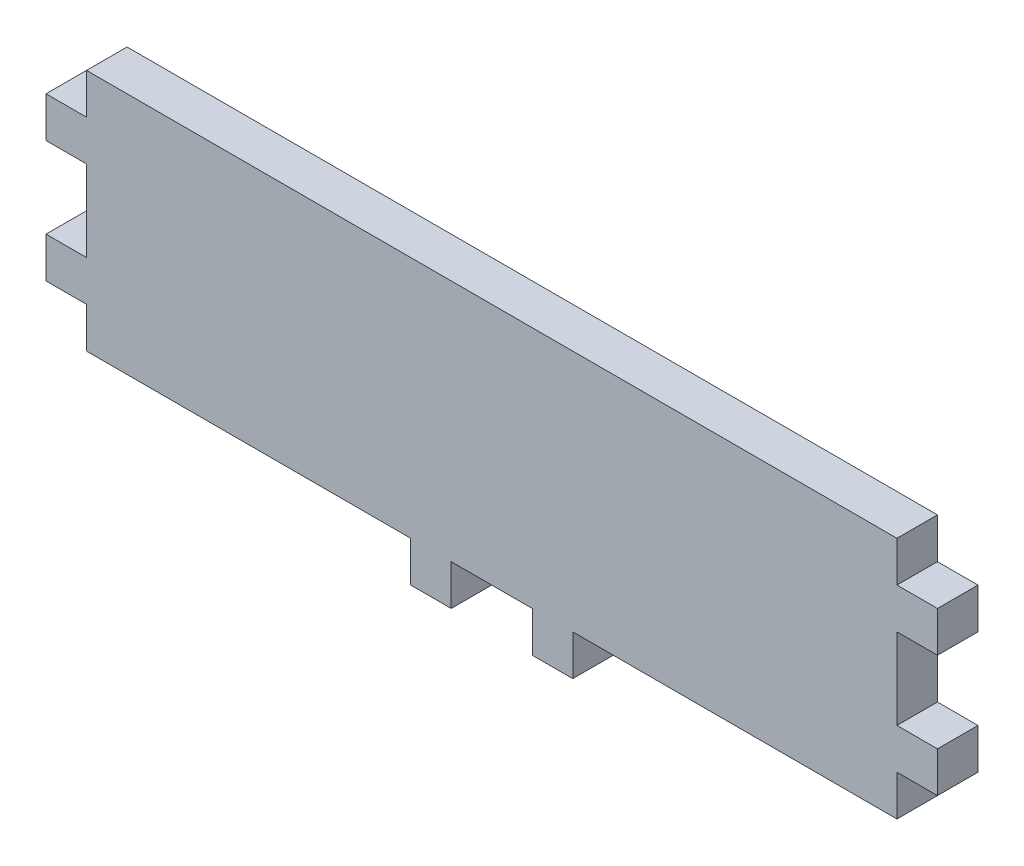
ISO-10303-21;
HEADER;
FILE_DESCRIPTION(('STEP AP214'),'2;1');
FILE_NAME('part.step','',(''),(''),'','','');
FILE_SCHEMA(('AUTOMOTIVE_DESIGN { 1 0 10303 214 1 1 1 1 }'));
ENDSEC;
DATA;
#1=APPLICATION_CONTEXT('core data for automotive mechanical design processes');
#2=APPLICATION_PROTOCOL_DEFINITION('international standard','automotive_design',2000,#1);
#3=PRODUCT_CONTEXT('',#1,'mechanical');
#4=PRODUCT('Part','Part','',(#3));
#5=PRODUCT_RELATED_PRODUCT_CATEGORY('part','',(#4));
#6=PRODUCT_DEFINITION_FORMATION('','',#4);
#7=PRODUCT_DEFINITION_CONTEXT('part definition',#1,'design');
#8=PRODUCT_DEFINITION('design','',#6,#7);
#9=PRODUCT_DEFINITION_SHAPE('','',#8);
#10=(LENGTH_UNIT() NAMED_UNIT(*) SI_UNIT(.MILLI.,.METRE.));
#11=(NAMED_UNIT(*) PLANE_ANGLE_UNIT() SI_UNIT($,.RADIAN.));
#12=(NAMED_UNIT(*) SI_UNIT($,.STERADIAN.) SOLID_ANGLE_UNIT());
#13=UNCERTAINTY_MEASURE_WITH_UNIT(LENGTH_MEASURE(1.E-05),#10,'distance_accuracy_value','');
#14=(GEOMETRIC_REPRESENTATION_CONTEXT(3) GLOBAL_UNCERTAINTY_ASSIGNED_CONTEXT((#13)) GLOBAL_UNIT_ASSIGNED_CONTEXT((#10,
#11,#12)) REPRESENTATION_CONTEXT('',''));
#15=CARTESIAN_POINT('',(0.,0.,0.));
#16=DIRECTION('',(0.,0.,1.));
#17=DIRECTION('',(1.,0.,0.));
#18=AXIS2_PLACEMENT_3D('',#15,#16,#17);
#19=CARTESIAN_POINT('',(5.,0.,5.));
#20=DIRECTION('',(0.,1.,0.));
#21=DIRECTION('',(-1.,0.,0.));
#22=AXIS2_PLACEMENT_3D('',#19,#20,#21);
#23=PLANE('',#22);
#24=DIRECTION('',(1.,0.,0.));
#25=VECTOR('',#24,1.);
#26=CARTESIAN_POINT('',(5.,0.,0.));
#27=LINE('',#26,#25);
#28=CARTESIAN_POINT('',(0.,0.,0.));
#29=VERTEX_POINT('',#28);
#30=CARTESIAN_POINT('',(5.,0.,0.));
#31=VERTEX_POINT('',#30);
#32=EDGE_CURVE('E260',#29,#31,#27,.T.);
#33=ORIENTED_EDGE('',*,*,#32,.T.);
#34=DIRECTION('',(0.,0.,-1.));
#35=VECTOR('',#34,1.);
#36=CARTESIAN_POINT('',(5.,0.,5.));
#37=LINE('',#36,#35);
#38=CARTESIAN_POINT('',(5.,0.,5.));
#39=VERTEX_POINT('',#38);
#40=EDGE_CURVE('E11',#39,#31,#37,.T.);
#41=ORIENTED_EDGE('',*,*,#40,.F.);
#42=DIRECTION('',(1.,0.,0.));
#43=VECTOR('',#42,1.);
#44=CARTESIAN_POINT('',(5.,0.,5.));
#45=LINE('',#44,#43);
#46=CARTESIAN_POINT('',(0.,0.,5.));
#47=VERTEX_POINT('',#46);
#48=EDGE_CURVE('E342',#47,#39,#45,.T.);
#49=ORIENTED_EDGE('',*,*,#48,.F.);
#50=DIRECTION('',(0.,0.,-1.));
#51=VECTOR('',#50,1.);
#52=CARTESIAN_POINT('',(0.,0.,5.));
#53=LINE('',#52,#51);
#54=EDGE_CURVE('E256',#47,#29,#53,.T.);
#55=ORIENTED_EDGE('',*,*,#54,.T.);
#56=EDGE_LOOP('',(#33,#41,#49,#55));
#57=FACE_BOUND('',#56,.T.);
#58=ADVANCED_FACE('F39',(#57),#23,.F.);
#59=CARTESIAN_POINT('',(5.,5.,5.));
#60=DIRECTION('',(-1.,0.,0.));
#61=DIRECTION('',(0.,-1.,0.));
#62=AXIS2_PLACEMENT_3D('',#59,#60,#61);
#63=PLANE('',#62);
#64=DIRECTION('',(0.,1.,0.));
#65=VECTOR('',#64,1.);
#66=CARTESIAN_POINT('',(5.,5.,0.));
#67=LINE('',#66,#65);
#68=CARTESIAN_POINT('',(5.,5.,0.));
#69=VERTEX_POINT('',#68);
#70=EDGE_CURVE('E264',#31,#69,#67,.T.);
#71=ORIENTED_EDGE('',*,*,#70,.T.);
#72=DIRECTION('',(0.,0.,-1.));
#73=VECTOR('',#72,1.);
#74=CARTESIAN_POINT('',(5.,5.,5.));
#75=LINE('',#74,#73);
#76=CARTESIAN_POINT('',(5.,5.,5.));
#77=VERTEX_POINT('',#76);
#78=EDGE_CURVE('E48',#77,#69,#75,.T.);
#79=ORIENTED_EDGE('',*,*,#78,.F.);
#80=DIRECTION('',(0.,1.,0.));
#81=VECTOR('',#80,1.);
#82=CARTESIAN_POINT('',(5.,5.,5.));
#83=LINE('',#82,#81);
#84=EDGE_CURVE('E159',#39,#77,#83,.T.);
#85=ORIENTED_EDGE('',*,*,#84,.F.);
#86=ORIENTED_EDGE('',*,*,#40,.T.);
#87=EDGE_LOOP('',(#71,#79,#85,#86));
#88=FACE_BOUND('',#87,.T.);
#89=ADVANCED_FACE('F548',(#88),#63,.F.);
#90=CARTESIAN_POINT('',(15.,5.,5.));
#91=DIRECTION('',(0.,1.,0.));
#92=DIRECTION('',(-1.,0.,0.));
#93=AXIS2_PLACEMENT_3D('',#90,#91,#92);
#94=PLANE('',#93);
#95=DIRECTION('',(1.,0.,0.));
#96=VECTOR('',#95,1.);
#97=CARTESIAN_POINT('',(15.,5.,0.));
#98=LINE('',#97,#96);
#99=CARTESIAN_POINT('',(15.,5.,0.));
#100=VERTEX_POINT('',#99);
#101=EDGE_CURVE('E267',#69,#100,#98,.T.);
#102=ORIENTED_EDGE('',*,*,#101,.T.);
#103=DIRECTION('',(0.,0.,-1.));
#104=VECTOR('',#103,1.);
#105=CARTESIAN_POINT('',(15.,5.,5.));
#106=LINE('',#105,#104);
#107=CARTESIAN_POINT('',(15.,5.,5.));
#108=VERTEX_POINT('',#107);
#109=EDGE_CURVE('E433',#108,#100,#106,.T.);
#110=ORIENTED_EDGE('',*,*,#109,.F.);
#111=DIRECTION('',(1.,0.,0.));
#112=VECTOR('',#111,1.);
#113=CARTESIAN_POINT('',(15.,5.,5.));
#114=LINE('',#113,#112);
#115=EDGE_CURVE('E443',#77,#108,#114,.T.);
#116=ORIENTED_EDGE('',*,*,#115,.F.);
#117=ORIENTED_EDGE('',*,*,#78,.T.);
#118=EDGE_LOOP('',(#102,#110,#116,#117));
#119=FACE_BOUND('',#118,.T.);
#120=ADVANCED_FACE('F441',(#119),#94,.F.);
#121=CARTESIAN_POINT('',(15.,0.,5.));
#122=DIRECTION('',(1.,0.,0.));
#123=DIRECTION('',(0.,0.,-1.));
#124=AXIS2_PLACEMENT_3D('',#121,#122,#123);
#125=PLANE('',#124);
#126=DIRECTION('',(0.,-1.,0.));
#127=VECTOR('',#126,1.);
#128=CARTESIAN_POINT('',(15.,0.,0.));
#129=LINE('',#128,#127);
#130=CARTESIAN_POINT('',(15.,0.,0.));
#131=VERTEX_POINT('',#130);
#132=EDGE_CURVE('E270',#100,#131,#129,.T.);
#133=ORIENTED_EDGE('',*,*,#132,.T.);
#134=DIRECTION('',(0.,0.,-1.));
#135=VECTOR('',#134,1.);
#136=CARTESIAN_POINT('',(15.,0.,5.));
#137=LINE('',#136,#135);
#138=CARTESIAN_POINT('',(15.,0.,5.));
#139=VERTEX_POINT('',#138);
#140=EDGE_CURVE('E429',#139,#131,#137,.T.);
#141=ORIENTED_EDGE('',*,*,#140,.F.);
#142=DIRECTION('',(0.,-1.,0.));
#143=VECTOR('',#142,1.);
#144=CARTESIAN_POINT('',(15.,0.,5.));
#145=LINE('',#144,#143);
#146=EDGE_CURVE('E462',#108,#139,#145,.T.);
#147=ORIENTED_EDGE('',*,*,#146,.F.);
#148=ORIENTED_EDGE('',*,*,#109,.T.);
#149=EDGE_LOOP('',(#133,#141,#147,#148));
#150=FACE_BOUND('',#149,.T.);
#151=ADVANCED_FACE('F452',(#150),#125,.F.);
#152=CARTESIAN_POINT('',(20.,0.,5.));
#153=DIRECTION('',(0.,1.,0.));
#154=DIRECTION('',(-1.,0.,0.));
#155=AXIS2_PLACEMENT_3D('',#152,#153,#154);
#156=PLANE('',#155);
#157=DIRECTION('',(1.,0.,0.));
#158=VECTOR('',#157,1.);
#159=CARTESIAN_POINT('',(20.,0.,0.));
#160=LINE('',#159,#158);
#161=CARTESIAN_POINT('',(20.,0.,0.));
#162=VERTEX_POINT('',#161);
#163=EDGE_CURVE('E273',#131,#162,#160,.T.);
#164=ORIENTED_EDGE('',*,*,#163,.T.);
#165=DIRECTION('',(0.,0.,-1.));
#166=VECTOR('',#165,1.);
#167=CARTESIAN_POINT('',(20.,0.,5.));
#168=LINE('',#167,#166);
#169=CARTESIAN_POINT('',(20.,0.,5.));
#170=VERTEX_POINT('',#169);
#171=EDGE_CURVE('E425',#170,#162,#168,.T.);
#172=ORIENTED_EDGE('',*,*,#171,.F.);
#173=DIRECTION('',(1.,0.,0.));
#174=VECTOR('',#173,1.);
#175=CARTESIAN_POINT('',(20.,0.,5.));
#176=LINE('',#175,#174);
#177=EDGE_CURVE('E458',#139,#170,#176,.T.);
#178=ORIENTED_EDGE('',*,*,#177,.F.);
#179=ORIENTED_EDGE('',*,*,#140,.T.);
#180=EDGE_LOOP('',(#164,#172,#178,#179));
#181=FACE_BOUND('',#180,.T.);
#182=ADVANCED_FACE('F456',(#181),#156,.F.);
#183=CARTESIAN_POINT('',(20.,5.,5.));
#184=DIRECTION('',(-1.,0.,0.));
#185=DIRECTION('',(0.,-1.,0.));
#186=AXIS2_PLACEMENT_3D('',#183,#184,#185);
#187=PLANE('',#186);
#188=DIRECTION('',(0.,1.,0.));
#189=VECTOR('',#188,1.);
#190=CARTESIAN_POINT('',(20.,5.,0.));
#191=LINE('',#190,#189);
#192=CARTESIAN_POINT('',(20.,5.,0.));
#193=VERTEX_POINT('',#192);
#194=EDGE_CURVE('E276',#162,#193,#191,.T.);
#195=ORIENTED_EDGE('',*,*,#194,.T.);
#196=DIRECTION('',(0.,0.,-1.));
#197=VECTOR('',#196,1.);
#198=CARTESIAN_POINT('',(20.,5.,5.));
#199=LINE('',#198,#197);
#200=CARTESIAN_POINT('',(20.,5.,5.));
#201=VERTEX_POINT('',#200);
#202=EDGE_CURVE('E421',#201,#193,#199,.T.);
#203=ORIENTED_EDGE('',*,*,#202,.F.);
#204=DIRECTION('',(0.,1.,0.));
#205=VECTOR('',#204,1.);
#206=CARTESIAN_POINT('',(20.,5.,5.));
#207=LINE('',#206,#205);
#208=EDGE_CURVE('E461',#170,#201,#207,.T.);
#209=ORIENTED_EDGE('',*,*,#208,.F.);
#210=ORIENTED_EDGE('',*,*,#171,.T.);
#211=EDGE_LOOP('',(#195,#203,#209,#210));
#212=FACE_BOUND('',#211,.T.);
#213=ADVANCED_FACE('F561',(#212),#187,.F.);
#214=CARTESIAN_POINT('',(60.,5.00000000000001,5.));
#215=DIRECTION('',(0.,1.,0.));
#216=DIRECTION('',(-1.,0.,0.));
#217=AXIS2_PLACEMENT_3D('',#214,#215,#216);
#218=PLANE('',#217);
#219=DIRECTION('',(1.,0.,0.));
#220=VECTOR('',#219,1.);
#221=CARTESIAN_POINT('',(60.,5.00000000000001,0.));
#222=LINE('',#221,#220);
#223=CARTESIAN_POINT('',(60.,5.00000000000001,0.));
#224=VERTEX_POINT('',#223);
#225=EDGE_CURVE('E279',#193,#224,#222,.T.);
#226=ORIENTED_EDGE('',*,*,#225,.T.);
#227=DIRECTION('',(0.,0.,-1.));
#228=VECTOR('',#227,1.);
#229=CARTESIAN_POINT('',(60.,5.00000000000001,5.));
#230=LINE('',#229,#228);
#231=CARTESIAN_POINT('',(60.,5.00000000000001,5.));
#232=VERTEX_POINT('',#231);
#233=EDGE_CURVE('E417',#232,#224,#230,.T.);
#234=ORIENTED_EDGE('',*,*,#233,.F.);
#235=DIRECTION('',(1.,0.,0.));
#236=VECTOR('',#235,1.);
#237=CARTESIAN_POINT('',(60.,5.00000000000001,5.));
#238=LINE('',#237,#236);
#239=EDGE_CURVE('E466',#201,#232,#238,.T.);
#240=ORIENTED_EDGE('',*,*,#239,.F.);
#241=ORIENTED_EDGE('',*,*,#202,.T.);
#242=EDGE_LOOP('',(#226,#234,#240,#241));
#243=FACE_BOUND('',#242,.T.);
#244=ADVANCED_FACE('F564',(#243),#218,.F.);
#245=CARTESIAN_POINT('',(60.,10.0002749662121,5.));
#246=DIRECTION('',(-1.,0.,0.));
#247=DIRECTION('',(0.,0.,1.));
#248=AXIS2_PLACEMENT_3D('',#245,#246,#247);
#249=PLANE('',#248);
#250=DIRECTION('',(0.,1.,0.));
#251=VECTOR('',#250,1.);
#252=CARTESIAN_POINT('',(60.,10.0002749662121,0.));
#253=LINE('',#252,#251);
#254=CARTESIAN_POINT('',(60.,10.0002749662121,0.));
#255=VERTEX_POINT('',#254);
#256=EDGE_CURVE('E282',#224,#255,#253,.T.);
#257=ORIENTED_EDGE('',*,*,#256,.T.);
#258=DIRECTION('',(0.,0.,-1.));
#259=VECTOR('',#258,1.);
#260=CARTESIAN_POINT('',(60.,10.0002749662121,5.));
#261=LINE('',#260,#259);
#262=CARTESIAN_POINT('',(60.,10.0002749662121,5.));
#263=VERTEX_POINT('',#262);
#264=EDGE_CURVE('E413',#263,#255,#261,.T.);
#265=ORIENTED_EDGE('',*,*,#264,.F.);
#266=DIRECTION('',(0.,1.,0.));
#267=VECTOR('',#266,1.);
#268=CARTESIAN_POINT('',(60.,10.0002749662121,5.));
#269=LINE('',#268,#267);
#270=EDGE_CURVE('E473',#232,#263,#269,.T.);
#271=ORIENTED_EDGE('',*,*,#270,.F.);
#272=ORIENTED_EDGE('',*,*,#233,.T.);
#273=EDGE_LOOP('',(#257,#265,#271,#272));
#274=FACE_BOUND('',#273,.T.);
#275=ADVANCED_FACE('F568',(#274),#249,.F.);
#276=CARTESIAN_POINT('',(65.,10.0002749662121,5.));
#277=DIRECTION('',(0.,1.,0.));
#278=DIRECTION('',(-1.,0.,0.));
#279=AXIS2_PLACEMENT_3D('',#276,#277,#278);
#280=PLANE('',#279);
#281=DIRECTION('',(1.,0.,0.));
#282=VECTOR('',#281,1.);
#283=CARTESIAN_POINT('',(65.,10.0002749662121,0.));
#284=LINE('',#283,#282);
#285=CARTESIAN_POINT('',(65.,10.0002749662121,0.));
#286=VERTEX_POINT('',#285);
#287=EDGE_CURVE('E285',#255,#286,#284,.T.);
#288=ORIENTED_EDGE('',*,*,#287,.T.);
#289=DIRECTION('',(0.,0.,-1.));
#290=VECTOR('',#289,1.);
#291=CARTESIAN_POINT('',(65.,10.0002749662121,5.));
#292=LINE('',#291,#290);
#293=CARTESIAN_POINT('',(65.,10.0002749662121,5.));
#294=VERTEX_POINT('',#293);
#295=EDGE_CURVE('E409',#294,#286,#292,.T.);
#296=ORIENTED_EDGE('',*,*,#295,.F.);
#297=DIRECTION('',(1.,0.,0.));
#298=VECTOR('',#297,1.);
#299=CARTESIAN_POINT('',(65.,10.0002749662121,5.));
#300=LINE('',#299,#298);
#301=EDGE_CURVE('E476',#263,#294,#300,.T.);
#302=ORIENTED_EDGE('',*,*,#301,.F.);
#303=ORIENTED_EDGE('',*,*,#264,.T.);
#304=EDGE_LOOP('',(#288,#296,#302,#303));
#305=FACE_BOUND('',#304,.T.);
#306=ADVANCED_FACE('F572',(#305),#280,.F.);
#307=CARTESIAN_POINT('',(65.,15.0002749662121,5.));
#308=DIRECTION('',(-1.,0.,0.));
#309=DIRECTION('',(0.,-1.,0.));
#310=AXIS2_PLACEMENT_3D('',#307,#308,#309);
#311=PLANE('',#310);
#312=DIRECTION('',(0.,1.,0.));
#313=VECTOR('',#312,1.);
#314=CARTESIAN_POINT('',(65.,15.0002749662121,0.));
#315=LINE('',#314,#313);
#316=CARTESIAN_POINT('',(65.,15.0002749662121,0.));
#317=VERTEX_POINT('',#316);
#318=EDGE_CURVE('E288',#286,#317,#315,.T.);
#319=ORIENTED_EDGE('',*,*,#318,.T.);
#320=DIRECTION('',(0.,0.,-1.));
#321=VECTOR('',#320,1.);
#322=CARTESIAN_POINT('',(65.,15.0002749662121,5.));
#323=LINE('',#322,#321);
#324=CARTESIAN_POINT('',(65.,15.0002749662121,5.));
#325=VERTEX_POINT('',#324);
#326=EDGE_CURVE('E405',#325,#317,#323,.T.);
#327=ORIENTED_EDGE('',*,*,#326,.F.);
#328=DIRECTION('',(0.,1.,0.));
#329=VECTOR('',#328,1.);
#330=CARTESIAN_POINT('',(65.,15.0002749662121,5.));
#331=LINE('',#330,#329);
#332=EDGE_CURVE('E479',#294,#325,#331,.T.);
#333=ORIENTED_EDGE('',*,*,#332,.F.);
#334=ORIENTED_EDGE('',*,*,#295,.T.);
#335=EDGE_LOOP('',(#319,#327,#333,#334));
#336=FACE_BOUND('',#335,.T.);
#337=ADVANCED_FACE('F576',(#336),#311,.F.);
#338=CARTESIAN_POINT('',(60.,15.0002749662121,5.));
#339=DIRECTION('',(0.,-1.,0.));
#340=DIRECTION('',(1.,0.,0.));
#341=AXIS2_PLACEMENT_3D('',#338,#339,#340);
#342=PLANE('',#341);
#343=DIRECTION('',(-1.,0.,0.));
#344=VECTOR('',#343,1.);
#345=CARTESIAN_POINT('',(60.,15.0002749662121,0.));
#346=LINE('',#345,#344);
#347=CARTESIAN_POINT('',(60.,15.0002749662121,0.));
#348=VERTEX_POINT('',#347);
#349=EDGE_CURVE('E291',#317,#348,#346,.T.);
#350=ORIENTED_EDGE('',*,*,#349,.T.);
#351=DIRECTION('',(0.,0.,-1.));
#352=VECTOR('',#351,1.);
#353=CARTESIAN_POINT('',(60.,15.0002749662121,5.));
#354=LINE('',#353,#352);
#355=CARTESIAN_POINT('',(60.,15.0002749662121,5.));
#356=VERTEX_POINT('',#355);
#357=EDGE_CURVE('E401',#356,#348,#354,.T.);
#358=ORIENTED_EDGE('',*,*,#357,.F.);
#359=DIRECTION('',(-1.,0.,0.));
#360=VECTOR('',#359,1.);
#361=CARTESIAN_POINT('',(60.,15.0002749662121,5.));
#362=LINE('',#361,#360);
#363=EDGE_CURVE('E482',#325,#356,#362,.T.);
#364=ORIENTED_EDGE('',*,*,#363,.F.);
#365=ORIENTED_EDGE('',*,*,#326,.T.);
#366=EDGE_LOOP('',(#350,#358,#364,#365));
#367=FACE_BOUND('',#366,.T.);
#368=ADVANCED_FACE('F580',(#367),#342,.F.);
#369=CARTESIAN_POINT('',(60.,25.0002749662121,5.));
#370=DIRECTION('',(-1.,0.,0.));
#371=DIRECTION('',(0.,0.,1.));
#372=AXIS2_PLACEMENT_3D('',#369,#370,#371);
#373=PLANE('',#372);
#374=DIRECTION('',(0.,1.,0.));
#375=VECTOR('',#374,1.);
#376=CARTESIAN_POINT('',(60.,25.0002749662121,0.));
#377=LINE('',#376,#375);
#378=CARTESIAN_POINT('',(60.,25.0002749662121,0.));
#379=VERTEX_POINT('',#378);
#380=EDGE_CURVE('E294',#348,#379,#377,.T.);
#381=ORIENTED_EDGE('',*,*,#380,.T.);
#382=DIRECTION('',(0.,0.,-1.));
#383=VECTOR('',#382,1.);
#384=CARTESIAN_POINT('',(60.,25.0002749662121,5.));
#385=LINE('',#384,#383);
#386=CARTESIAN_POINT('',(60.,25.0002749662121,5.));
#387=VERTEX_POINT('',#386);
#388=EDGE_CURVE('E397',#387,#379,#385,.T.);
#389=ORIENTED_EDGE('',*,*,#388,.F.);
#390=DIRECTION('',(0.,1.,0.));
#391=VECTOR('',#390,1.);
#392=CARTESIAN_POINT('',(60.,25.0002749662121,5.));
#393=LINE('',#392,#391);
#394=EDGE_CURVE('E485',#356,#387,#393,.T.);
#395=ORIENTED_EDGE('',*,*,#394,.F.);
#396=ORIENTED_EDGE('',*,*,#357,.T.);
#397=EDGE_LOOP('',(#381,#389,#395,#396));
#398=FACE_BOUND('',#397,.T.);
#399=ADVANCED_FACE('F584',(#398),#373,.F.);
#400=CARTESIAN_POINT('',(65.,25.0002749662121,5.));
#401=DIRECTION('',(0.,1.,0.));
#402=DIRECTION('',(0.,0.,1.));
#403=AXIS2_PLACEMENT_3D('',#400,#401,#402);
#404=PLANE('',#403);
#405=DIRECTION('',(1.,0.,0.));
#406=VECTOR('',#405,1.);
#407=CARTESIAN_POINT('',(65.,25.0002749662121,0.));
#408=LINE('',#407,#406);
#409=CARTESIAN_POINT('',(65.,25.0002749662121,0.));
#410=VERTEX_POINT('',#409);
#411=EDGE_CURVE('E297',#379,#410,#408,.T.);
#412=ORIENTED_EDGE('',*,*,#411,.T.);
#413=DIRECTION('',(0.,0.,-1.));
#414=VECTOR('',#413,1.);
#415=CARTESIAN_POINT('',(65.,25.0002749662121,5.));
#416=LINE('',#415,#414);
#417=CARTESIAN_POINT('',(65.,25.0002749662121,5.));
#418=VERTEX_POINT('',#417);
#419=EDGE_CURVE('E393',#418,#410,#416,.T.);
#420=ORIENTED_EDGE('',*,*,#419,.F.);
#421=DIRECTION('',(1.,0.,0.));
#422=VECTOR('',#421,1.);
#423=CARTESIAN_POINT('',(65.,25.0002749662121,5.));
#424=LINE('',#423,#422);
#425=EDGE_CURVE('E488',#387,#418,#424,.T.);
#426=ORIENTED_EDGE('',*,*,#425,.F.);
#427=ORIENTED_EDGE('',*,*,#388,.T.);
#428=EDGE_LOOP('',(#412,#420,#426,#427));
#429=FACE_BOUND('',#428,.T.);
#430=ADVANCED_FACE('F588',(#429),#404,.F.);
#431=CARTESIAN_POINT('',(65.,30.0002749662121,5.));
#432=DIRECTION('',(-1.,0.,0.));
#433=DIRECTION('',(0.,0.,1.));
#434=AXIS2_PLACEMENT_3D('',#431,#432,#433);
#435=PLANE('',#434);
#436=DIRECTION('',(0.,1.,0.));
#437=VECTOR('',#436,1.);
#438=CARTESIAN_POINT('',(65.,30.0002749662121,0.));
#439=LINE('',#438,#437);
#440=CARTESIAN_POINT('',(65.,30.0002749662121,0.));
#441=VERTEX_POINT('',#440);
#442=EDGE_CURVE('E300',#410,#441,#439,.T.);
#443=ORIENTED_EDGE('',*,*,#442,.T.);
#444=DIRECTION('',(0.,0.,-1.));
#445=VECTOR('',#444,1.);
#446=CARTESIAN_POINT('',(65.,30.0002749662121,5.));
#447=LINE('',#446,#445);
#448=CARTESIAN_POINT('',(65.,30.0002749662121,5.));
#449=VERTEX_POINT('',#448);
#450=EDGE_CURVE('E389',#449,#441,#447,.T.);
#451=ORIENTED_EDGE('',*,*,#450,.F.);
#452=DIRECTION('',(0.,1.,0.));
#453=VECTOR('',#452,1.);
#454=CARTESIAN_POINT('',(65.,30.0002749662121,5.));
#455=LINE('',#454,#453);
#456=EDGE_CURVE('E491',#418,#449,#455,.T.);
#457=ORIENTED_EDGE('',*,*,#456,.F.);
#458=ORIENTED_EDGE('',*,*,#419,.T.);
#459=EDGE_LOOP('',(#443,#451,#457,#458));
#460=FACE_BOUND('',#459,.T.);
#461=ADVANCED_FACE('F592',(#460),#435,.F.);
#462=CARTESIAN_POINT('',(60.,30.0002749662121,5.));
#463=DIRECTION('',(0.,-1.,0.));
#464=DIRECTION('',(0.,0.,-1.));
#465=AXIS2_PLACEMENT_3D('',#462,#463,#464);
#466=PLANE('',#465);
#467=DIRECTION('',(-1.,0.,0.));
#468=VECTOR('',#467,1.);
#469=CARTESIAN_POINT('',(60.,30.0002749662121,0.));
#470=LINE('',#469,#468);
#471=CARTESIAN_POINT('',(60.,30.0002749662121,0.));
#472=VERTEX_POINT('',#471);
#473=EDGE_CURVE('E303',#441,#472,#470,.T.);
#474=ORIENTED_EDGE('',*,*,#473,.T.);
#475=DIRECTION('',(0.,0.,-1.));
#476=VECTOR('',#475,1.);
#477=CARTESIAN_POINT('',(60.,30.0002749662121,5.));
#478=LINE('',#477,#476);
#479=CARTESIAN_POINT('',(60.,30.0002749662121,5.));
#480=VERTEX_POINT('',#479);
#481=EDGE_CURVE('E385',#480,#472,#478,.T.);
#482=ORIENTED_EDGE('',*,*,#481,.F.);
#483=DIRECTION('',(-1.,0.,0.));
#484=VECTOR('',#483,1.);
#485=CARTESIAN_POINT('',(60.,30.0002749662121,5.));
#486=LINE('',#485,#484);
#487=EDGE_CURVE('E494',#449,#480,#486,.T.);
#488=ORIENTED_EDGE('',*,*,#487,.F.);
#489=ORIENTED_EDGE('',*,*,#450,.T.);
#490=EDGE_LOOP('',(#474,#482,#488,#489));
#491=FACE_BOUND('',#490,.T.);
#492=ADVANCED_FACE('F596',(#491),#466,.F.);
#493=CARTESIAN_POINT('',(60.,35.,5.));
#494=DIRECTION('',(-1.,0.,0.));
#495=DIRECTION('',(0.,0.,1.));
#496=AXIS2_PLACEMENT_3D('',#493,#494,#495);
#497=PLANE('',#496);
#498=DIRECTION('',(0.,1.,0.));
#499=VECTOR('',#498,1.);
#500=CARTESIAN_POINT('',(60.,35.,0.));
#501=LINE('',#500,#499);
#502=CARTESIAN_POINT('',(60.,35.,0.));
#503=VERTEX_POINT('',#502);
#504=EDGE_CURVE('E306',#472,#503,#501,.T.);
#505=ORIENTED_EDGE('',*,*,#504,.T.);
#506=DIRECTION('',(0.,0.,-1.));
#507=VECTOR('',#506,1.);
#508=CARTESIAN_POINT('',(60.,35.,5.));
#509=LINE('',#508,#507);
#510=CARTESIAN_POINT('',(60.,35.,5.));
#511=VERTEX_POINT('',#510);
#512=EDGE_CURVE('E381',#511,#503,#509,.T.);
#513=ORIENTED_EDGE('',*,*,#512,.F.);
#514=DIRECTION('',(0.,1.,0.));
#515=VECTOR('',#514,1.);
#516=CARTESIAN_POINT('',(60.,35.,5.));
#517=LINE('',#516,#515);
#518=EDGE_CURVE('E497',#480,#511,#517,.T.);
#519=ORIENTED_EDGE('',*,*,#518,.F.);
#520=ORIENTED_EDGE('',*,*,#481,.T.);
#521=EDGE_LOOP('',(#505,#513,#519,#520));
#522=FACE_BOUND('',#521,.T.);
#523=ADVANCED_FACE('F600',(#522),#497,.F.);
#524=CARTESIAN_POINT('',(-40.,35.,5.));
#525=DIRECTION('',(0.,-1.,0.));
#526=DIRECTION('',(1.,0.,0.));
#527=AXIS2_PLACEMENT_3D('',#524,#525,#526);
#528=PLANE('',#527);
#529=DIRECTION('',(-1.,0.,0.));
#530=VECTOR('',#529,1.);
#531=CARTESIAN_POINT('',(-40.,35.,0.));
#532=LINE('',#531,#530);
#533=CARTESIAN_POINT('',(-40.,35.,0.));
#534=VERTEX_POINT('',#533);
#535=EDGE_CURVE('E309',#503,#534,#532,.T.);
#536=ORIENTED_EDGE('',*,*,#535,.T.);
#537=DIRECTION('',(0.,0.,-1.));
#538=VECTOR('',#537,1.);
#539=CARTESIAN_POINT('',(-40.,35.,5.));
#540=LINE('',#539,#538);
#541=CARTESIAN_POINT('',(-40.,35.,5.));
#542=VERTEX_POINT('',#541);
#543=EDGE_CURVE('E377',#542,#534,#540,.T.);
#544=ORIENTED_EDGE('',*,*,#543,.F.);
#545=DIRECTION('',(-1.,0.,0.));
#546=VECTOR('',#545,1.);
#547=CARTESIAN_POINT('',(-40.,35.,5.));
#548=LINE('',#547,#546);
#549=EDGE_CURVE('E500',#511,#542,#548,.T.);
#550=ORIENTED_EDGE('',*,*,#549,.F.);
#551=ORIENTED_EDGE('',*,*,#512,.T.);
#552=EDGE_LOOP('',(#536,#544,#550,#551));
#553=FACE_BOUND('',#552,.T.);
#554=ADVANCED_FACE('F604',(#553),#528,.F.);
#555=CARTESIAN_POINT('',(-40.,30.0002749662121,5.));
#556=DIRECTION('',(1.,0.,0.));
#557=DIRECTION('',(0.,0.,-1.));
#558=AXIS2_PLACEMENT_3D('',#555,#556,#557);
#559=PLANE('',#558);
#560=DIRECTION('',(0.,-1.,0.));
#561=VECTOR('',#560,1.);
#562=CARTESIAN_POINT('',(-40.,30.0002749662121,0.));
#563=LINE('',#562,#561);
#564=CARTESIAN_POINT('',(-40.,30.0002749662121,0.));
#565=VERTEX_POINT('',#564);
#566=EDGE_CURVE('E312',#534,#565,#563,.T.);
#567=ORIENTED_EDGE('',*,*,#566,.T.);
#568=DIRECTION('',(0.,0.,-1.));
#569=VECTOR('',#568,1.);
#570=CARTESIAN_POINT('',(-40.,30.0002749662121,5.));
#571=LINE('',#570,#569);
#572=CARTESIAN_POINT('',(-40.,30.0002749662121,5.));
#573=VERTEX_POINT('',#572);
#574=EDGE_CURVE('E373',#573,#565,#571,.T.);
#575=ORIENTED_EDGE('',*,*,#574,.F.);
#576=DIRECTION('',(0.,-1.,0.));
#577=VECTOR('',#576,1.);
#578=CARTESIAN_POINT('',(-40.,30.0002749662121,5.));
#579=LINE('',#578,#577);
#580=EDGE_CURVE('E503',#542,#573,#579,.T.);
#581=ORIENTED_EDGE('',*,*,#580,.F.);
#582=ORIENTED_EDGE('',*,*,#543,.T.);
#583=EDGE_LOOP('',(#567,#575,#581,#582));
#584=FACE_BOUND('',#583,.T.);
#585=ADVANCED_FACE('F608',(#584),#559,.F.);
#586=CARTESIAN_POINT('',(-45.,30.0002749662121,5.));
#587=DIRECTION('',(0.,-1.,0.));
#588=DIRECTION('',(0.,0.,-1.));
#589=AXIS2_PLACEMENT_3D('',#586,#587,#588);
#590=PLANE('',#589);
#591=DIRECTION('',(-1.,0.,0.));
#592=VECTOR('',#591,1.);
#593=CARTESIAN_POINT('',(-45.,30.0002749662121,0.));
#594=LINE('',#593,#592);
#595=CARTESIAN_POINT('',(-45.,30.0002749662121,0.));
#596=VERTEX_POINT('',#595);
#597=EDGE_CURVE('E315',#565,#596,#594,.T.);
#598=ORIENTED_EDGE('',*,*,#597,.T.);
#599=DIRECTION('',(0.,0.,-1.));
#600=VECTOR('',#599,1.);
#601=CARTESIAN_POINT('',(-45.,30.0002749662121,5.));
#602=LINE('',#601,#600);
#603=CARTESIAN_POINT('',(-45.,30.0002749662121,5.));
#604=VERTEX_POINT('',#603);
#605=EDGE_CURVE('E369',#604,#596,#602,.T.);
#606=ORIENTED_EDGE('',*,*,#605,.F.);
#607=DIRECTION('',(-1.,0.,0.));
#608=VECTOR('',#607,1.);
#609=CARTESIAN_POINT('',(-45.,30.0002749662121,5.));
#610=LINE('',#609,#608);
#611=EDGE_CURVE('E506',#573,#604,#610,.T.);
#612=ORIENTED_EDGE('',*,*,#611,.F.);
#613=ORIENTED_EDGE('',*,*,#574,.T.);
#614=EDGE_LOOP('',(#598,#606,#612,#613));
#615=FACE_BOUND('',#614,.T.);
#616=ADVANCED_FACE('F612',(#615),#590,.F.);
#617=CARTESIAN_POINT('',(-45.,25.0002749662121,5.));
#618=DIRECTION('',(1.,0.,0.));
#619=DIRECTION('',(0.,0.,-1.));
#620=AXIS2_PLACEMENT_3D('',#617,#618,#619);
#621=PLANE('',#620);
#622=DIRECTION('',(0.,-1.,0.));
#623=VECTOR('',#622,1.);
#624=CARTESIAN_POINT('',(-45.,25.0002749662121,0.));
#625=LINE('',#624,#623);
#626=CARTESIAN_POINT('',(-45.,25.0002749662121,0.));
#627=VERTEX_POINT('',#626);
#628=EDGE_CURVE('E318',#596,#627,#625,.T.);
#629=ORIENTED_EDGE('',*,*,#628,.T.);
#630=DIRECTION('',(0.,0.,-1.));
#631=VECTOR('',#630,1.);
#632=CARTESIAN_POINT('',(-45.,25.0002749662121,5.));
#633=LINE('',#632,#631);
#634=CARTESIAN_POINT('',(-45.,25.0002749662121,5.));
#635=VERTEX_POINT('',#634);
#636=EDGE_CURVE('E365',#635,#627,#633,.T.);
#637=ORIENTED_EDGE('',*,*,#636,.F.);
#638=DIRECTION('',(0.,-1.,0.));
#639=VECTOR('',#638,1.);
#640=CARTESIAN_POINT('',(-45.,25.0002749662121,5.));
#641=LINE('',#640,#639);
#642=EDGE_CURVE('E509',#604,#635,#641,.T.);
#643=ORIENTED_EDGE('',*,*,#642,.F.);
#644=ORIENTED_EDGE('',*,*,#605,.T.);
#645=EDGE_LOOP('',(#629,#637,#643,#644));
#646=FACE_BOUND('',#645,.T.);
#647=ADVANCED_FACE('F616',(#646),#621,.F.);
#648=CARTESIAN_POINT('',(-40.,25.0002749662121,5.));
#649=DIRECTION('',(0.,1.,0.));
#650=DIRECTION('',(0.,0.,1.));
#651=AXIS2_PLACEMENT_3D('',#648,#649,#650);
#652=PLANE('',#651);
#653=DIRECTION('',(1.,0.,0.));
#654=VECTOR('',#653,1.);
#655=CARTESIAN_POINT('',(-40.,25.0002749662121,0.));
#656=LINE('',#655,#654);
#657=CARTESIAN_POINT('',(-40.,25.0002749662121,0.));
#658=VERTEX_POINT('',#657);
#659=EDGE_CURVE('E321',#627,#658,#656,.T.);
#660=ORIENTED_EDGE('',*,*,#659,.T.);
#661=DIRECTION('',(0.,0.,-1.));
#662=VECTOR('',#661,1.);
#663=CARTESIAN_POINT('',(-40.,25.0002749662121,5.));
#664=LINE('',#663,#662);
#665=CARTESIAN_POINT('',(-40.,25.0002749662121,5.));
#666=VERTEX_POINT('',#665);
#667=EDGE_CURVE('E361',#666,#658,#664,.T.);
#668=ORIENTED_EDGE('',*,*,#667,.F.);
#669=DIRECTION('',(1.,0.,0.));
#670=VECTOR('',#669,1.);
#671=CARTESIAN_POINT('',(-40.,25.0002749662121,5.));
#672=LINE('',#671,#670);
#673=EDGE_CURVE('E512',#635,#666,#672,.T.);
#674=ORIENTED_EDGE('',*,*,#673,.F.);
#675=ORIENTED_EDGE('',*,*,#636,.T.);
#676=EDGE_LOOP('',(#660,#668,#674,#675));
#677=FACE_BOUND('',#676,.T.);
#678=ADVANCED_FACE('F620',(#677),#652,.F.);
#679=CARTESIAN_POINT('',(-40.,15.0002749662121,5.));
#680=DIRECTION('',(1.,0.,0.));
#681=DIRECTION('',(0.,0.,-1.));
#682=AXIS2_PLACEMENT_3D('',#679,#680,#681);
#683=PLANE('',#682);
#684=DIRECTION('',(0.,-1.,0.));
#685=VECTOR('',#684,1.);
#686=CARTESIAN_POINT('',(-40.,15.0002749662121,0.));
#687=LINE('',#686,#685);
#688=CARTESIAN_POINT('',(-40.,15.0002749662121,0.));
#689=VERTEX_POINT('',#688);
#690=EDGE_CURVE('E324',#658,#689,#687,.T.);
#691=ORIENTED_EDGE('',*,*,#690,.T.);
#692=DIRECTION('',(0.,0.,-1.));
#693=VECTOR('',#692,1.);
#694=CARTESIAN_POINT('',(-40.,15.0002749662121,5.));
#695=LINE('',#694,#693);
#696=CARTESIAN_POINT('',(-40.,15.0002749662121,5.));
#697=VERTEX_POINT('',#696);
#698=EDGE_CURVE('E357',#697,#689,#695,.T.);
#699=ORIENTED_EDGE('',*,*,#698,.F.);
#700=DIRECTION('',(0.,-1.,0.));
#701=VECTOR('',#700,1.);
#702=CARTESIAN_POINT('',(-40.,15.0002749662121,5.));
#703=LINE('',#702,#701);
#704=EDGE_CURVE('E515',#666,#697,#703,.T.);
#705=ORIENTED_EDGE('',*,*,#704,.F.);
#706=ORIENTED_EDGE('',*,*,#667,.T.);
#707=EDGE_LOOP('',(#691,#699,#705,#706));
#708=FACE_BOUND('',#707,.T.);
#709=ADVANCED_FACE('F624',(#708),#683,.F.);
#710=CARTESIAN_POINT('',(-45.,15.0002749662121,5.));
#711=DIRECTION('',(0.,-1.,0.));
#712=DIRECTION('',(1.,0.,0.));
#713=AXIS2_PLACEMENT_3D('',#710,#711,#712);
#714=PLANE('',#713);
#715=DIRECTION('',(-1.,0.,0.));
#716=VECTOR('',#715,1.);
#717=CARTESIAN_POINT('',(-45.,15.0002749662121,0.));
#718=LINE('',#717,#716);
#719=CARTESIAN_POINT('',(-45.,15.0002749662121,0.));
#720=VERTEX_POINT('',#719);
#721=EDGE_CURVE('E327',#689,#720,#718,.T.);
#722=ORIENTED_EDGE('',*,*,#721,.T.);
#723=DIRECTION('',(0.,0.,-1.));
#724=VECTOR('',#723,1.);
#725=CARTESIAN_POINT('',(-45.,15.0002749662121,5.));
#726=LINE('',#725,#724);
#727=CARTESIAN_POINT('',(-45.,15.0002749662121,5.));
#728=VERTEX_POINT('',#727);
#729=EDGE_CURVE('E353',#728,#720,#726,.T.);
#730=ORIENTED_EDGE('',*,*,#729,.F.);
#731=DIRECTION('',(-1.,0.,0.));
#732=VECTOR('',#731,1.);
#733=CARTESIAN_POINT('',(-45.,15.0002749662121,5.));
#734=LINE('',#733,#732);
#735=EDGE_CURVE('E518',#697,#728,#734,.T.);
#736=ORIENTED_EDGE('',*,*,#735,.F.);
#737=ORIENTED_EDGE('',*,*,#698,.T.);
#738=EDGE_LOOP('',(#722,#730,#736,#737));
#739=FACE_BOUND('',#738,.T.);
#740=ADVANCED_FACE('F628',(#739),#714,.F.);
#741=CARTESIAN_POINT('',(-45.,10.0002749662121,5.));
#742=DIRECTION('',(1.,0.,0.));
#743=DIRECTION('',(0.,1.,0.));
#744=AXIS2_PLACEMENT_3D('',#741,#742,#743);
#745=PLANE('',#744);
#746=DIRECTION('',(0.,-1.,0.));
#747=VECTOR('',#746,1.);
#748=CARTESIAN_POINT('',(-45.,10.0002749662121,0.));
#749=LINE('',#748,#747);
#750=CARTESIAN_POINT('',(-45.,10.0002749662121,0.));
#751=VERTEX_POINT('',#750);
#752=EDGE_CURVE('E330',#720,#751,#749,.T.);
#753=ORIENTED_EDGE('',*,*,#752,.T.);
#754=DIRECTION('',(0.,0.,-1.));
#755=VECTOR('',#754,1.);
#756=CARTESIAN_POINT('',(-45.,10.0002749662121,5.));
#757=LINE('',#756,#755);
#758=CARTESIAN_POINT('',(-45.,10.0002749662121,5.));
#759=VERTEX_POINT('',#758);
#760=EDGE_CURVE('E349',#759,#751,#757,.T.);
#761=ORIENTED_EDGE('',*,*,#760,.F.);
#762=DIRECTION('',(0.,-1.,0.));
#763=VECTOR('',#762,1.);
#764=CARTESIAN_POINT('',(-45.,10.0002749662121,5.));
#765=LINE('',#764,#763);
#766=EDGE_CURVE('E521',#728,#759,#765,.T.);
#767=ORIENTED_EDGE('',*,*,#766,.F.);
#768=ORIENTED_EDGE('',*,*,#729,.T.);
#769=EDGE_LOOP('',(#753,#761,#767,#768));
#770=FACE_BOUND('',#769,.T.);
#771=ADVANCED_FACE('F529',(#770),#745,.F.);
#772=CARTESIAN_POINT('',(-40.,10.0002749662121,5.));
#773=DIRECTION('',(0.,1.,0.));
#774=DIRECTION('',(0.,0.,1.));
#775=AXIS2_PLACEMENT_3D('',#772,#773,#774);
#776=PLANE('',#775);
#777=DIRECTION('',(1.,0.,0.));
#778=VECTOR('',#777,1.);
#779=CARTESIAN_POINT('',(-40.,10.0002749662121,0.));
#780=LINE('',#779,#778);
#781=CARTESIAN_POINT('',(-40.,10.0002749662121,0.));
#782=VERTEX_POINT('',#781);
#783=EDGE_CURVE('E333',#751,#782,#780,.T.);
#784=ORIENTED_EDGE('',*,*,#783,.T.);
#785=DIRECTION('',(0.,0.,-1.));
#786=VECTOR('',#785,1.);
#787=CARTESIAN_POINT('',(-40.,10.0002749662121,5.));
#788=LINE('',#787,#786);
#789=CARTESIAN_POINT('',(-40.,10.0002749662121,5.));
#790=VERTEX_POINT('',#789);
#791=EDGE_CURVE('E249',#790,#782,#788,.T.);
#792=ORIENTED_EDGE('',*,*,#791,.F.);
#793=DIRECTION('',(1.,0.,0.));
#794=VECTOR('',#793,1.);
#795=CARTESIAN_POINT('',(-40.,10.0002749662121,5.));
#796=LINE('',#795,#794);
#797=EDGE_CURVE('E238',#759,#790,#796,.T.);
#798=ORIENTED_EDGE('',*,*,#797,.F.);
#799=ORIENTED_EDGE('',*,*,#760,.T.);
#800=EDGE_LOOP('',(#784,#792,#798,#799));
#801=FACE_BOUND('',#800,.T.);
#802=ADVANCED_FACE('F533',(#801),#776,.F.);
#803=CARTESIAN_POINT('',(-40.,5.,5.));
#804=DIRECTION('',(1.,0.,0.));
#805=DIRECTION('',(0.,0.,-1.));
#806=AXIS2_PLACEMENT_3D('',#803,#804,#805);
#807=PLANE('',#806);
#808=DIRECTION('',(0.,-1.,0.));
#809=VECTOR('',#808,1.);
#810=CARTESIAN_POINT('',(-40.,5.,0.));
#811=LINE('',#810,#809);
#812=CARTESIAN_POINT('',(-40.,5.,0.));
#813=VERTEX_POINT('',#812);
#814=EDGE_CURVE('E247',#782,#813,#811,.T.);
#815=ORIENTED_EDGE('',*,*,#814,.T.);
#816=DIRECTION('',(0.,0.,-1.));
#817=VECTOR('',#816,1.);
#818=CARTESIAN_POINT('',(-40.,5.,5.));
#819=LINE('',#818,#817);
#820=CARTESIAN_POINT('',(-40.,5.,5.));
#821=VERTEX_POINT('',#820);
#822=EDGE_CURVE('E244',#821,#813,#819,.T.);
#823=ORIENTED_EDGE('',*,*,#822,.F.);
#824=DIRECTION('',(0.,-1.,0.));
#825=VECTOR('',#824,1.);
#826=CARTESIAN_POINT('',(-40.,5.,5.));
#827=LINE('',#826,#825);
#828=EDGE_CURVE('E232',#790,#821,#827,.T.);
#829=ORIENTED_EDGE('',*,*,#828,.F.);
#830=ORIENTED_EDGE('',*,*,#791,.T.);
#831=EDGE_LOOP('',(#815,#823,#829,#830));
#832=FACE_BOUND('',#831,.T.);
#833=ADVANCED_FACE('F245',(#832),#807,.F.);
#834=CARTESIAN_POINT('',(0.,5.,5.));
#835=DIRECTION('',(0.,1.,0.));
#836=DIRECTION('',(-1.,0.,0.));
#837=AXIS2_PLACEMENT_3D('',#834,#835,#836);
#838=PLANE('',#837);
#839=DIRECTION('',(1.,0.,0.));
#840=VECTOR('',#839,1.);
#841=CARTESIAN_POINT('',(0.,5.,0.));
#842=LINE('',#841,#840);
#843=CARTESIAN_POINT('',(0.,5.,0.));
#844=VERTEX_POINT('',#843);
#845=EDGE_CURVE('E145',#813,#844,#842,.T.);
#846=ORIENTED_EDGE('',*,*,#845,.T.);
#847=DIRECTION('',(0.,0.,-1.));
#848=VECTOR('',#847,1.);
#849=CARTESIAN_POINT('',(0.,5.,5.));
#850=LINE('',#849,#848);
#851=CARTESIAN_POINT('',(0.,5.,5.));
#852=VERTEX_POINT('',#851);
#853=EDGE_CURVE('E250',#852,#844,#850,.T.);
#854=ORIENTED_EDGE('',*,*,#853,.F.);
#855=DIRECTION('',(1.,0.,0.));
#856=VECTOR('',#855,1.);
#857=CARTESIAN_POINT('',(0.,5.,5.));
#858=LINE('',#857,#856);
#859=EDGE_CURVE('E236',#821,#852,#858,.T.);
#860=ORIENTED_EDGE('',*,*,#859,.F.);
#861=ORIENTED_EDGE('',*,*,#822,.T.);
#862=EDGE_LOOP('',(#846,#854,#860,#861));
#863=FACE_BOUND('',#862,.T.);
#864=ADVANCED_FACE('F252',(#863),#838,.F.);
#865=CARTESIAN_POINT('',(0.,0.,5.));
#866=DIRECTION('',(1.,0.,0.));
#867=DIRECTION('',(0.,0.,-1.));
#868=AXIS2_PLACEMENT_3D('',#865,#866,#867);
#869=PLANE('',#868);
#870=DIRECTION('',(0.,-1.,0.));
#871=VECTOR('',#870,1.);
#872=CARTESIAN_POINT('',(0.,0.,0.));
#873=LINE('',#872,#871);
#874=EDGE_CURVE('E151',#844,#29,#873,.T.);
#875=ORIENTED_EDGE('',*,*,#874,.T.);
#876=ORIENTED_EDGE('',*,*,#54,.F.);
#877=DIRECTION('',(0.,-1.,0.));
#878=VECTOR('',#877,1.);
#879=CARTESIAN_POINT('',(0.,0.,5.));
#880=LINE('',#879,#878);
#881=EDGE_CURVE('E56',#852,#47,#880,.T.);
#882=ORIENTED_EDGE('',*,*,#881,.F.);
#883=ORIENTED_EDGE('',*,*,#853,.T.);
#884=EDGE_LOOP('',(#875,#876,#882,#883));
#885=FACE_BOUND('',#884,.T.);
#886=ADVANCED_FACE('F537',(#885),#869,.F.);
#887=CARTESIAN_POINT('',(0.,0.,5.));
#888=DIRECTION('',(0.,0.,-1.));
#889=DIRECTION('',(-1.,0.,0.));
#890=AXIS2_PLACEMENT_3D('',#887,#888,#889);
#891=PLANE('',#890);
#892=ORIENTED_EDGE('',*,*,#48,.T.);
#893=ORIENTED_EDGE('',*,*,#84,.T.);
#894=ORIENTED_EDGE('',*,*,#115,.T.);
#895=ORIENTED_EDGE('',*,*,#146,.T.);
#896=ORIENTED_EDGE('',*,*,#177,.T.);
#897=ORIENTED_EDGE('',*,*,#208,.T.);
#898=ORIENTED_EDGE('',*,*,#239,.T.);
#899=ORIENTED_EDGE('',*,*,#270,.T.);
#900=ORIENTED_EDGE('',*,*,#301,.T.);
#901=ORIENTED_EDGE('',*,*,#332,.T.);
#902=ORIENTED_EDGE('',*,*,#363,.T.);
#903=ORIENTED_EDGE('',*,*,#394,.T.);
#904=ORIENTED_EDGE('',*,*,#425,.T.);
#905=ORIENTED_EDGE('',*,*,#456,.T.);
#906=ORIENTED_EDGE('',*,*,#487,.T.);
#907=ORIENTED_EDGE('',*,*,#518,.T.);
#908=ORIENTED_EDGE('',*,*,#549,.T.);
#909=ORIENTED_EDGE('',*,*,#580,.T.);
#910=ORIENTED_EDGE('',*,*,#611,.T.);
#911=ORIENTED_EDGE('',*,*,#642,.T.);
#912=ORIENTED_EDGE('',*,*,#673,.T.);
#913=ORIENTED_EDGE('',*,*,#704,.T.);
#914=ORIENTED_EDGE('',*,*,#735,.T.);
#915=ORIENTED_EDGE('',*,*,#766,.T.);
#916=ORIENTED_EDGE('',*,*,#797,.T.);
#917=ORIENTED_EDGE('',*,*,#828,.T.);
#918=ORIENTED_EDGE('',*,*,#859,.T.);
#919=ORIENTED_EDGE('',*,*,#881,.T.);
#920=EDGE_LOOP('',(#892,#893,#894,#895,#896,#897,#898,#899,#900,#901,#902,#903,#904,#905,#906,
#907,#908,#909,#910,#911,#912,#913,#914,#915,#916,#917,#918,#919));
#921=FACE_BOUND('',#920,.T.);
#922=ADVANCED_FACE('F234',(#921),#891,.F.);
#923=CARTESIAN_POINT('',(0.,0.,0.));
#924=DIRECTION('',(0.,0.,-1.));
#925=DIRECTION('',(-1.,0.,0.));
#926=AXIS2_PLACEMENT_3D('',#923,#924,#925);
#927=PLANE('',#926);
#928=ORIENTED_EDGE('',*,*,#32,.F.);
#929=ORIENTED_EDGE('',*,*,#874,.F.);
#930=ORIENTED_EDGE('',*,*,#845,.F.);
#931=ORIENTED_EDGE('',*,*,#814,.F.);
#932=ORIENTED_EDGE('',*,*,#783,.F.);
#933=ORIENTED_EDGE('',*,*,#752,.F.);
#934=ORIENTED_EDGE('',*,*,#721,.F.);
#935=ORIENTED_EDGE('',*,*,#690,.F.);
#936=ORIENTED_EDGE('',*,*,#659,.F.);
#937=ORIENTED_EDGE('',*,*,#628,.F.);
#938=ORIENTED_EDGE('',*,*,#597,.F.);
#939=ORIENTED_EDGE('',*,*,#566,.F.);
#940=ORIENTED_EDGE('',*,*,#535,.F.);
#941=ORIENTED_EDGE('',*,*,#504,.F.);
#942=ORIENTED_EDGE('',*,*,#473,.F.);
#943=ORIENTED_EDGE('',*,*,#442,.F.);
#944=ORIENTED_EDGE('',*,*,#411,.F.);
#945=ORIENTED_EDGE('',*,*,#380,.F.);
#946=ORIENTED_EDGE('',*,*,#349,.F.);
#947=ORIENTED_EDGE('',*,*,#318,.F.);
#948=ORIENTED_EDGE('',*,*,#287,.F.);
#949=ORIENTED_EDGE('',*,*,#256,.F.);
#950=ORIENTED_EDGE('',*,*,#225,.F.);
#951=ORIENTED_EDGE('',*,*,#194,.F.);
#952=ORIENTED_EDGE('',*,*,#163,.F.);
#953=ORIENTED_EDGE('',*,*,#132,.F.);
#954=ORIENTED_EDGE('',*,*,#101,.F.);
#955=ORIENTED_EDGE('',*,*,#70,.F.);
#956=EDGE_LOOP('',(#928,#929,#930,#931,#932,#933,#934,#935,#936,#937,#938,#939,#940,#941,#942,
#943,#944,#945,#946,#947,#948,#949,#950,#951,#952,#953,#954,#955));
#957=FACE_BOUND('',#956,.T.);
#958=ADVANCED_FACE('F447',(#957),#927,.T.);
#959=CLOSED_SHELL('',(#58,#89,#120,#151,#182,#213,#244,#275,#306,#337,#368,#399,#430,#461,#492,
#523,#554,#585,#616,#647,#678,#709,#740,#771,#802,#833,#864,#886,#922,#958));
#960=MANIFOLD_SOLID_BREP('B2',#959);
#961=ADVANCED_BREP_SHAPE_REPRESENTATION('',(#18,#960),#14);
#962=SHAPE_DEFINITION_REPRESENTATION(#9,#961);
ENDSEC;
END-ISO-10303-21;
